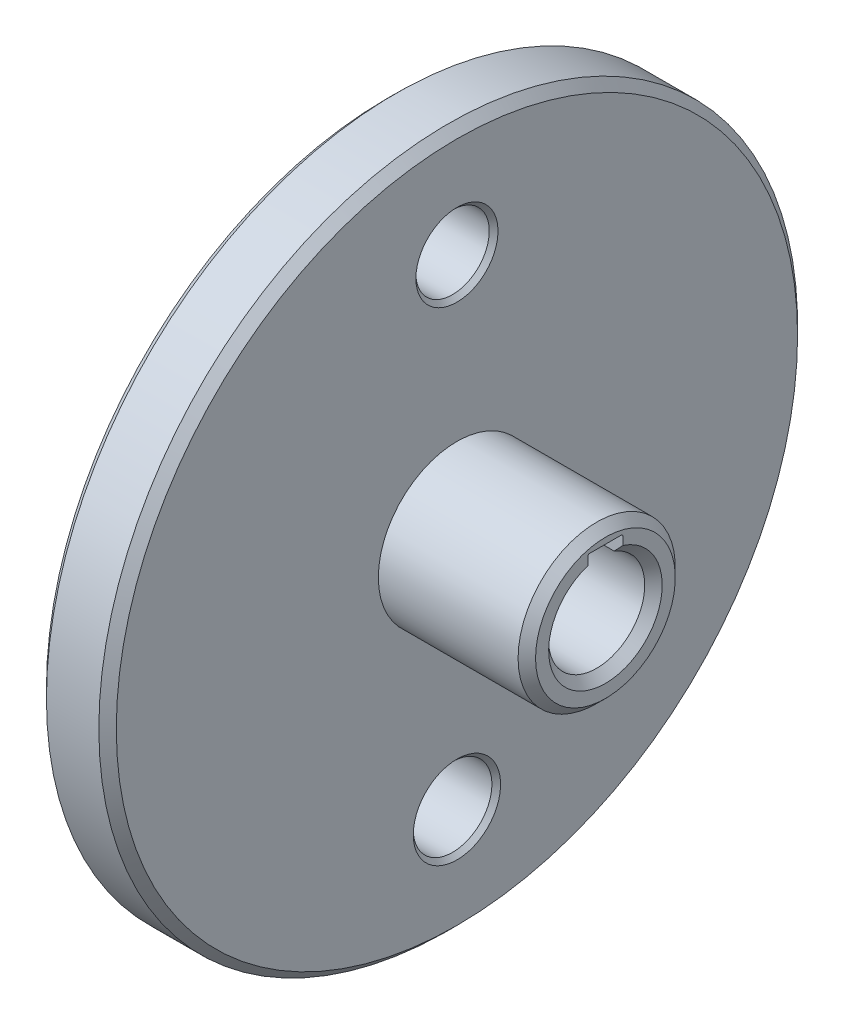
ISO-10303-21;
HEADER;
FILE_DESCRIPTION(('STEP AP214'),'2;1');
FILE_NAME('part.step','',(''),(''),'','','');
FILE_SCHEMA(('AUTOMOTIVE_DESIGN { 1 0 10303 214 1 1 1 1 }'));
ENDSEC;
DATA;
#1=APPLICATION_CONTEXT('core data for automotive mechanical design processes');
#2=APPLICATION_PROTOCOL_DEFINITION('international standard','automotive_design',2000,#1);
#3=PRODUCT_CONTEXT('',#1,'mechanical');
#4=PRODUCT('Part','Part','',(#3));
#5=PRODUCT_RELATED_PRODUCT_CATEGORY('part','',(#4));
#6=PRODUCT_DEFINITION_FORMATION('','',#4);
#7=PRODUCT_DEFINITION_CONTEXT('part definition',#1,'design');
#8=PRODUCT_DEFINITION('design','',#6,#7);
#9=PRODUCT_DEFINITION_SHAPE('','',#8);
#10=(LENGTH_UNIT() NAMED_UNIT(*) SI_UNIT(.MILLI.,.METRE.));
#11=(NAMED_UNIT(*) PLANE_ANGLE_UNIT() SI_UNIT($,.RADIAN.));
#12=(NAMED_UNIT(*) SI_UNIT($,.STERADIAN.) SOLID_ANGLE_UNIT());
#13=UNCERTAINTY_MEASURE_WITH_UNIT(LENGTH_MEASURE(1.E-05),#10,'distance_accuracy_value','');
#14=(GEOMETRIC_REPRESENTATION_CONTEXT(3) GLOBAL_UNCERTAINTY_ASSIGNED_CONTEXT((#13)) GLOBAL_UNIT_ASSIGNED_CONTEXT((#10,
#11,#12)) REPRESENTATION_CONTEXT('',''));
#15=CARTESIAN_POINT('',(0.,0.,0.));
#16=DIRECTION('',(0.,0.,1.));
#17=DIRECTION('',(1.,0.,0.));
#18=AXIS2_PLACEMENT_3D('',#15,#16,#17);
#19=CARTESIAN_POINT('',(25.,9.,0.));
#20=DIRECTION('',(-1.,0.,0.));
#21=DIRECTION('',(0.,0.,1.));
#22=AXIS2_PLACEMENT_3D('',#19,#20,#21);
#23=PLANE('',#22);
#24=CARTESIAN_POINT('',(25.,0.,0.));
#25=DIRECTION('',(-1.,0.,0.));
#26=DIRECTION('',(0.,0.,1.));
#27=AXIS2_PLACEMENT_3D('',#24,#25,#26);
#28=CIRCLE('',#27,8.00000000000001);
#29=CARTESIAN_POINT('',(25.,0.,8.00000000000001));
#30=VERTEX_POINT('',#29);
#31=EDGE_CURVE('E159',#30,#30,#28,.F.);
#32=ORIENTED_EDGE('',*,*,#31,.T.);
#33=EDGE_LOOP('',(#32));
#34=FACE_BOUND('',#33,.T.);
#35=DIRECTION('',(0.,1.,0.));
#36=VECTOR('',#35,1.);
#37=CARTESIAN_POINT('',(25.,7.30000000000003,-2.00000000000002));
#38=LINE('',#37,#36);
#39=CARTESIAN_POINT('',(25.,6.18465843842649,-2.00000000000002));
#40=VERTEX_POINT('',#39);
#41=CARTESIAN_POINT('',(25.,7.10000000000003,-2.00000000000002));
#42=VERTEX_POINT('',#41);
#43=EDGE_CURVE('E274',#40,#42,#38,.T.);
#44=ORIENTED_EDGE('',*,*,#43,.F.);
#45=CARTESIAN_POINT('',(25.,0.,0.));
#46=DIRECTION('',(-1.,0.,0.));
#47=DIRECTION('',(0.,0.,1.));
#48=AXIS2_PLACEMENT_3D('',#45,#46,#47);
#49=CIRCLE('',#48,6.50000000000001);
#50=CARTESIAN_POINT('',(25.,6.18465843842649,2.00000000000002));
#51=VERTEX_POINT('',#50);
#52=EDGE_CURVE('E162',#40,#51,#49,.T.);
#53=ORIENTED_EDGE('',*,*,#52,.T.);
#54=DIRECTION('',(0.,-1.,0.));
#55=VECTOR('',#54,1.);
#56=CARTESIAN_POINT('',(25.,7.30000000000003,2.00000000000002));
#57=LINE('',#56,#55);
#58=CARTESIAN_POINT('',(25.,7.10000000000003,2.00000000000002));
#59=VERTEX_POINT('',#58);
#60=EDGE_CURVE('E269',#59,#51,#57,.T.);
#61=ORIENTED_EDGE('',*,*,#60,.F.);
#62=CARTESIAN_POINT('',(25.,7.10000000000003,1.80000000000002));
#63=DIRECTION('',(-1.,0.,0.));
#64=DIRECTION('',(0.,0.,1.));
#65=AXIS2_PLACEMENT_3D('',#62,#63,#64);
#66=CIRCLE('',#65,0.2);
#67=CARTESIAN_POINT('',(25.,7.30000000000003,1.80000000000002));
#68=VERTEX_POINT('',#67);
#69=EDGE_CURVE('E145',#59,#68,#66,.T.);
#70=ORIENTED_EDGE('',*,*,#69,.T.);
#71=DIRECTION('',(0.,0.,1.));
#72=VECTOR('',#71,1.);
#73=CARTESIAN_POINT('',(25.,7.30000000000003,-2.00000000000002));
#74=LINE('',#73,#72);
#75=CARTESIAN_POINT('',(25.,7.30000000000003,-1.80000000000002));
#76=VERTEX_POINT('',#75);
#77=EDGE_CURVE('E271',#76,#68,#74,.T.);
#78=ORIENTED_EDGE('',*,*,#77,.F.);
#79=CARTESIAN_POINT('',(25.,7.10000000000003,-1.80000000000002));
#80=DIRECTION('',(-1.,0.,0.));
#81=DIRECTION('',(0.,0.,1.));
#82=AXIS2_PLACEMENT_3D('',#79,#80,#81);
#83=CIRCLE('',#82,0.2);
#84=EDGE_CURVE('E140',#76,#42,#83,.T.);
#85=ORIENTED_EDGE('',*,*,#84,.T.);
#86=EDGE_LOOP('',(#44,#53,#61,#70,#78,#85));
#87=FACE_BOUND('',#86,.T.);
#88=ADVANCED_FACE('F34',(#34,#87),#23,.F.);
#89=CARTESIAN_POINT('',(0.,0.,0.));
#90=DIRECTION('',(-1.,0.,0.));
#91=DIRECTION('',(0.,0.,1.));
#92=AXIS2_PLACEMENT_3D('',#89,#90,#91);
#93=CYLINDRICAL_SURFACE('',#92,5.5);
#94=DIRECTION('',(-1.,0.,0.));
#95=VECTOR('',#94,1.);
#96=CARTESIAN_POINT('',(0.,5.12347538297979,2.00000000000002));
#97=LINE('',#96,#95);
#98=CARTESIAN_POINT('',(24.,5.12347538297979,2.00000000000002));
#99=VERTEX_POINT('',#98);
#100=CARTESIAN_POINT('',(2.,5.12347538297979,2.00000000000002));
#101=VERTEX_POINT('',#100);
#102=EDGE_CURVE('E108',#99,#101,#97,.T.);
#103=ORIENTED_EDGE('',*,*,#102,.F.);
#104=CARTESIAN_POINT('',(24.,0.,0.));
#105=DIRECTION('',(-1.,0.,0.));
#106=DIRECTION('',(0.,0.,1.));
#107=AXIS2_PLACEMENT_3D('',#104,#105,#106);
#108=CIRCLE('',#107,5.5);
#109=CARTESIAN_POINT('',(24.,5.12347538297979,-2.00000000000002));
#110=VERTEX_POINT('',#109);
#111=EDGE_CURVE('E49',#99,#110,#108,.F.);
#112=ORIENTED_EDGE('',*,*,#111,.T.);
#113=DIRECTION('',(-1.,0.,0.));
#114=VECTOR('',#113,1.);
#115=CARTESIAN_POINT('',(0.,5.12347538297979,-2.00000000000002));
#116=LINE('',#115,#114);
#117=CARTESIAN_POINT('',(2.,5.12347538297979,-2.00000000000002));
#118=VERTEX_POINT('',#117);
#119=EDGE_CURVE('E96',#118,#110,#116,.F.);
#120=ORIENTED_EDGE('',*,*,#119,.F.);
#121=CARTESIAN_POINT('',(2.,0.,0.));
#122=DIRECTION('',(-1.,0.,0.));
#123=DIRECTION('',(0.,0.,1.));
#124=AXIS2_PLACEMENT_3D('',#121,#122,#123);
#125=CIRCLE('',#124,5.5);
#126=EDGE_CURVE('E106',#118,#101,#125,.T.);
#127=ORIENTED_EDGE('',*,*,#126,.T.);
#128=EDGE_LOOP('',(#103,#112,#120,#127));
#129=FACE_BOUND('',#128,.T.);
#130=ADVANCED_FACE('F105',(#129),#93,.F.);
#131=CARTESIAN_POINT('',(2.,5.5,0.));
#132=DIRECTION('',(1.,0.,0.));
#133=DIRECTION('',(0.,0.,-1.));
#134=AXIS2_PLACEMENT_3D('',#131,#132,#133);
#135=PLANE('',#134);
#136=CARTESIAN_POINT('',(2.,0.,0.));
#137=DIRECTION('',(-1.,0.,0.));
#138=DIRECTION('',(0.,0.,1.));
#139=AXIS2_PLACEMENT_3D('',#136,#137,#138);
#140=CIRCLE('',#139,12.5);
#141=CARTESIAN_POINT('',(2.,0.,12.5));
#142=VERTEX_POINT('',#141);
#143=EDGE_CURVE('E115',#142,#142,#140,.T.);
#144=ORIENTED_EDGE('',*,*,#143,.T.);
#145=EDGE_LOOP('',(#144));
#146=FACE_BOUND('',#145,.T.);
#147=DIRECTION('',(0.,-1.,0.));
#148=VECTOR('',#147,1.);
#149=CARTESIAN_POINT('',(2.,5.5,-2.00000000000002));
#150=LINE('',#149,#148);
#151=CARTESIAN_POINT('',(2.,7.10000000000003,-2.00000000000002));
#152=VERTEX_POINT('',#151);
#153=EDGE_CURVE('E94',#152,#118,#150,.T.);
#154=ORIENTED_EDGE('',*,*,#153,.F.);
#155=CARTESIAN_POINT('',(2.,7.10000000000003,-1.80000000000002));
#156=DIRECTION('',(1.,0.,0.));
#157=DIRECTION('',(0.,0.,-1.));
#158=AXIS2_PLACEMENT_3D('',#155,#156,#157);
#159=CIRCLE('',#158,0.2);
#160=CARTESIAN_POINT('',(2.,7.30000000000003,-1.80000000000002));
#161=VERTEX_POINT('',#160);
#162=EDGE_CURVE('E138',#152,#161,#159,.T.);
#163=ORIENTED_EDGE('',*,*,#162,.T.);
#164=DIRECTION('',(0.,0.,-1.));
#165=VECTOR('',#164,1.);
#166=CARTESIAN_POINT('',(2.,7.30000000000003,0.));
#167=LINE('',#166,#165);
#168=CARTESIAN_POINT('',(2.,7.30000000000003,1.80000000000002));
#169=VERTEX_POINT('',#168);
#170=EDGE_CURVE('E102',#169,#161,#167,.T.);
#171=ORIENTED_EDGE('',*,*,#170,.F.);
#172=CARTESIAN_POINT('',(2.,7.10000000000003,1.80000000000002));
#173=DIRECTION('',(1.,0.,0.));
#174=DIRECTION('',(0.,0.,-1.));
#175=AXIS2_PLACEMENT_3D('',#172,#173,#174);
#176=CIRCLE('',#175,0.2);
#177=CARTESIAN_POINT('',(2.,7.10000000000003,2.00000000000002));
#178=VERTEX_POINT('',#177);
#179=EDGE_CURVE('E143',#169,#178,#176,.T.);
#180=ORIENTED_EDGE('',*,*,#179,.T.);
#181=DIRECTION('',(0.,1.,0.));
#182=VECTOR('',#181,1.);
#183=CARTESIAN_POINT('',(2.,5.5,2.00000000000002));
#184=LINE('',#183,#182);
#185=EDGE_CURVE('E113',#101,#178,#184,.T.);
#186=ORIENTED_EDGE('',*,*,#185,.F.);
#187=ORIENTED_EDGE('',*,*,#126,.F.);
#188=EDGE_LOOP('',(#154,#163,#171,#180,#186,#187));
#189=FACE_BOUND('',#188,.T.);
#190=ADVANCED_FACE('F111',(#146,#189),#135,.F.);
#191=CARTESIAN_POINT('',(0.,0.,0.));
#192=DIRECTION('',(-1.,0.,0.));
#193=DIRECTION('',(0.,0.,1.));
#194=AXIS2_PLACEMENT_3D('',#191,#192,#193);
#195=CYLINDRICAL_SURFACE('',#194,12.5);
#196=ORIENTED_EDGE('',*,*,#143,.F.);
#197=EDGE_LOOP('',(#196));
#198=FACE_BOUND('',#197,.T.);
#199=CARTESIAN_POINT('',(0.,0.,0.));
#200=DIRECTION('',(-1.,0.,0.));
#201=DIRECTION('',(0.,0.,1.));
#202=AXIS2_PLACEMENT_3D('',#199,#200,#201);
#203=CIRCLE('',#202,12.5);
#204=CARTESIAN_POINT('',(0.,0.,12.5));
#205=VERTEX_POINT('',#204);
#206=EDGE_CURVE('E118',#205,#205,#203,.T.);
#207=ORIENTED_EDGE('',*,*,#206,.T.);
#208=EDGE_LOOP('',(#207));
#209=FACE_BOUND('',#208,.T.);
#210=ADVANCED_FACE('F210',(#198,#209),#195,.F.);
#211=CARTESIAN_POINT('',(0.,12.5,0.));
#212=DIRECTION('',(1.,0.,0.));
#213=DIRECTION('',(0.,0.,-1.));
#214=AXIS2_PLACEMENT_3D('',#211,#212,#213);
#215=PLANE('',#214);
#216=CARTESIAN_POINT('',(0.,0.,0.));
#217=DIRECTION('',(1.,0.,0.));
#218=DIRECTION('',(0.,0.,-1.));
#219=AXIS2_PLACEMENT_3D('',#216,#217,#218);
#220=CIRCLE('',#219,39.);
#221=CARTESIAN_POINT('',(0.,0.,-39.));
#222=VERTEX_POINT('',#221);
#223=EDGE_CURVE('E156',#222,#222,#220,.F.);
#224=ORIENTED_EDGE('',*,*,#223,.T.);
#225=EDGE_LOOP('',(#224));
#226=FACE_BOUND('',#225,.T.);
#227=CARTESIAN_POINT('',(0.,-27.5,-1.06119072911152E-13));
#228=DIRECTION('',(1.,0.,0.));
#229=DIRECTION('',(0.,0.,-1.));
#230=AXIS2_PLACEMENT_3D('',#227,#228,#229);
#231=CIRCLE('',#230,4.5);
#232=CARTESIAN_POINT('',(0.,-27.5,-4.50000000000011));
#233=VERTEX_POINT('',#232);
#234=EDGE_CURVE('E107',#233,#233,#231,.T.);
#235=ORIENTED_EDGE('',*,*,#234,.T.);
#236=EDGE_LOOP('',(#235));
#237=FACE_BOUND('',#236,.T.);
#238=CARTESIAN_POINT('',(0.,27.5,0.));
#239=DIRECTION('',(1.,0.,0.));
#240=DIRECTION('',(0.,0.,-1.));
#241=AXIS2_PLACEMENT_3D('',#238,#239,#240);
#242=CIRCLE('',#241,4.2);
#243=CARTESIAN_POINT('',(0.,27.5,-4.2000000000001));
#244=VERTEX_POINT('',#243);
#245=EDGE_CURVE('E121',#244,#244,#242,.T.);
#246=ORIENTED_EDGE('',*,*,#245,.T.);
#247=EDGE_LOOP('',(#246));
#248=FACE_BOUND('',#247,.T.);
#249=ORIENTED_EDGE('',*,*,#206,.F.);
#250=EDGE_LOOP('',(#249));
#251=FACE_BOUND('',#250,.T.);
#252=ADVANCED_FACE('F227',(#226,#237,#248,#251),#215,.F.);
#253=CARTESIAN_POINT('',(0.,0.,0.));
#254=DIRECTION('',(-1.,0.,0.));
#255=DIRECTION('',(0.,0.,1.));
#256=AXIS2_PLACEMENT_3D('',#253,#254,#255);
#257=CYLINDRICAL_SURFACE('',#256,40.);
#258=CARTESIAN_POINT('',(7.,0.,0.));
#259=DIRECTION('',(-1.,0.,0.));
#260=DIRECTION('',(0.,0.,1.));
#261=AXIS2_PLACEMENT_3D('',#258,#259,#260);
#262=CIRCLE('',#261,40.);
#263=CARTESIAN_POINT('',(7.,0.,40.));
#264=VERTEX_POINT('',#263);
#265=EDGE_CURVE('E150',#264,#264,#262,.T.);
#266=ORIENTED_EDGE('',*,*,#265,.T.);
#267=EDGE_LOOP('',(#266));
#268=FACE_BOUND('',#267,.T.);
#269=CARTESIAN_POINT('',(1.00000000000002,0.,0.));
#270=DIRECTION('',(1.,0.,0.));
#271=DIRECTION('',(0.,0.,-1.));
#272=AXIS2_PLACEMENT_3D('',#269,#270,#271);
#273=CIRCLE('',#272,40.);
#274=CARTESIAN_POINT('',(1.00000000000002,0.,-40.));
#275=VERTEX_POINT('',#274);
#276=EDGE_CURVE('E147',#275,#275,#273,.T.);
#277=ORIENTED_EDGE('',*,*,#276,.T.);
#278=EDGE_LOOP('',(#277));
#279=FACE_BOUND('',#278,.T.);
#280=ADVANCED_FACE('F223',(#268,#279),#257,.T.);
#281=CARTESIAN_POINT('',(8.,40.,0.));
#282=DIRECTION('',(-1.,0.,0.));
#283=DIRECTION('',(0.,0.,1.));
#284=AXIS2_PLACEMENT_3D('',#281,#282,#283);
#285=PLANE('',#284);
#286=CARTESIAN_POINT('',(8.,-27.5,-1.06119072911152E-13));
#287=DIRECTION('',(-1.,0.,0.));
#288=DIRECTION('',(0.,0.,1.));
#289=AXIS2_PLACEMENT_3D('',#286,#287,#288);
#290=CIRCLE('',#289,5.00000000000001);
#291=CARTESIAN_POINT('',(8.,-27.5,4.9999999999999));
#292=VERTEX_POINT('',#291);
#293=EDGE_CURVE('E42',#292,#292,#290,.T.);
#294=ORIENTED_EDGE('',*,*,#293,.T.);
#295=EDGE_LOOP('',(#294));
#296=FACE_BOUND('',#295,.T.);
#297=CARTESIAN_POINT('',(8.,27.5,0.));
#298=DIRECTION('',(-1.,0.,0.));
#299=DIRECTION('',(0.,0.,1.));
#300=AXIS2_PLACEMENT_3D('',#297,#298,#299);
#301=CIRCLE('',#300,4.7);
#302=CARTESIAN_POINT('',(8.,27.5,4.6999999999999));
#303=VERTEX_POINT('',#302);
#304=EDGE_CURVE('E405',#303,#303,#301,.T.);
#305=ORIENTED_EDGE('',*,*,#304,.T.);
#306=EDGE_LOOP('',(#305));
#307=FACE_BOUND('',#306,.T.);
#308=CARTESIAN_POINT('',(8.,0.,0.));
#309=DIRECTION('',(-1.,0.,0.));
#310=DIRECTION('',(0.,0.,1.));
#311=AXIS2_PLACEMENT_3D('',#308,#309,#310);
#312=CIRCLE('',#311,39.);
#313=CARTESIAN_POINT('',(8.,0.,39.));
#314=VERTEX_POINT('',#313);
#315=EDGE_CURVE('E153',#314,#314,#312,.F.);
#316=ORIENTED_EDGE('',*,*,#315,.T.);
#317=EDGE_LOOP('',(#316));
#318=FACE_BOUND('',#317,.T.);
#319=CARTESIAN_POINT('',(8.,0.,0.));
#320=DIRECTION('',(-1.,0.,0.));
#321=DIRECTION('',(0.,0.,1.));
#322=AXIS2_PLACEMENT_3D('',#319,#320,#321);
#323=CIRCLE('',#322,9.);
#324=CARTESIAN_POINT('',(8.,0.,9.));
#325=VERTEX_POINT('',#324);
#326=EDGE_CURVE('E114',#325,#325,#323,.T.);
#327=ORIENTED_EDGE('',*,*,#326,.T.);
#328=EDGE_LOOP('',(#327));
#329=FACE_BOUND('',#328,.T.);
#330=ADVANCED_FACE('F219',(#296,#307,#318,#329),#285,.F.);
#331=CARTESIAN_POINT('',(0.,0.,0.));
#332=DIRECTION('',(-1.,0.,0.));
#333=DIRECTION('',(0.,0.,1.));
#334=AXIS2_PLACEMENT_3D('',#331,#332,#333);
#335=CYLINDRICAL_SURFACE('',#334,9.);
#336=CARTESIAN_POINT('',(24.,0.,0.));
#337=DIRECTION('',(-1.,0.,0.));
#338=DIRECTION('',(0.,0.,1.));
#339=AXIS2_PLACEMENT_3D('',#336,#337,#338);
#340=CIRCLE('',#339,9.);
#341=CARTESIAN_POINT('',(24.,0.,9.));
#342=VERTEX_POINT('',#341);
#343=EDGE_CURVE('E193',#342,#342,#340,.T.);
#344=ORIENTED_EDGE('',*,*,#343,.T.);
#345=EDGE_LOOP('',(#344));
#346=FACE_BOUND('',#345,.T.);
#347=ORIENTED_EDGE('',*,*,#326,.F.);
#348=EDGE_LOOP('',(#347));
#349=FACE_BOUND('',#348,.T.);
#350=ADVANCED_FACE('F206',(#346,#349),#335,.T.);
#351=CARTESIAN_POINT('',(25.,27.5,0.));
#352=DIRECTION('',(-1.,0.,0.));
#353=DIRECTION('',(0.,0.,1.));
#354=AXIS2_PLACEMENT_3D('',#351,#352,#353);
#355=CYLINDRICAL_SURFACE('',#354,4.2);
#356=CARTESIAN_POINT('',(7.49999999999999,27.5,0.));
#357=DIRECTION('',(-1.,0.,0.));
#358=DIRECTION('',(0.,0.,1.));
#359=AXIS2_PLACEMENT_3D('',#356,#357,#358);
#360=CIRCLE('',#359,4.2);
#361=CARTESIAN_POINT('',(7.49999999999999,27.5,4.19999999999991));
#362=VERTEX_POINT('',#361);
#363=EDGE_CURVE('E11',#362,#362,#360,.F.);
#364=ORIENTED_EDGE('',*,*,#363,.T.);
#365=EDGE_LOOP('',(#364));
#366=FACE_BOUND('',#365,.T.);
#367=ORIENTED_EDGE('',*,*,#245,.F.);
#368=EDGE_LOOP('',(#367));
#369=FACE_BOUND('',#368,.T.);
#370=ADVANCED_FACE('F202',(#366,#369),#355,.F.);
#371=CARTESIAN_POINT('',(25.,-27.5,-1.06119072911152E-13));
#372=DIRECTION('',(-1.,0.,0.));
#373=DIRECTION('',(0.,0.,1.));
#374=AXIS2_PLACEMENT_3D('',#371,#372,#373);
#375=CYLINDRICAL_SURFACE('',#374,4.5);
#376=CARTESIAN_POINT('',(7.5,-27.5,-1.06119072911152E-13));
#377=DIRECTION('',(-1.,0.,0.));
#378=DIRECTION('',(0.,0.,1.));
#379=AXIS2_PLACEMENT_3D('',#376,#377,#378);
#380=CIRCLE('',#379,4.5);
#381=CARTESIAN_POINT('',(7.5,-27.5,4.49999999999989));
#382=VERTEX_POINT('',#381);
#383=EDGE_CURVE('E408',#382,#382,#380,.F.);
#384=ORIENTED_EDGE('',*,*,#383,.T.);
#385=EDGE_LOOP('',(#384));
#386=FACE_BOUND('',#385,.T.);
#387=ORIENTED_EDGE('',*,*,#234,.F.);
#388=EDGE_LOOP('',(#387));
#389=FACE_BOUND('',#388,.T.);
#390=ADVANCED_FACE('F199',(#386,#389),#375,.F.);
#391=CARTESIAN_POINT('',(25.,7.30000000000003,-2.00000000000002));
#392=DIRECTION('',(0.,0.,1.));
#393=DIRECTION('',(1.,0.,0.));
#394=AXIS2_PLACEMENT_3D('',#391,#392,#393);
#395=PLANE('',#394);
#396=ORIENTED_EDGE('',*,*,#119,.T.);
#397=CARTESIAN_POINT('',(24.,5.12347538297979,-2.00000000000002));
#398=CARTESIAN_POINT('',(24.0828251706964,5.21238503394926,-2.00000000000002));
#399=CARTESIAN_POINT('',(24.1658004879446,5.30115459754863,-2.00000000000002));
#400=CARTESIAN_POINT('',(24.33201525737,5.4784449735909,-2.00000000000002));
#401=CARTESIAN_POINT('',(24.4152547077199,5.56696578774673,-2.00000000000002));
#402=CARTESIAN_POINT('',(24.5819625961778,5.74379117352451,-2.00000000000002));
#403=CARTESIAN_POINT('',(24.6654310339187,5.83209574549255,-2.00000000000002));
#404=CARTESIAN_POINT('',(24.8325704963148,6.00851413113025,-2.00000000000002));
#405=CARTESIAN_POINT('',(24.9162415223627,6.09662794348051,-2.00000000000002));
#406=CARTESIAN_POINT('',(25.,6.18465843842649,-2.00000000000002));
#407=B_SPLINE_CURVE_WITH_KNOTS('',3,(#397,#398,#399,#400,#401,#402,#403,#404,#405,#406),
.UNSPECIFIED.,.F.,.F.,(4,2,2,2,4),(0.,0.36453274511342,0.729062973788622,1.09359261865378,
1.45812477680436),.UNSPECIFIED.);
#408=EDGE_CURVE('E186',#110,#40,#407,.T.);
#409=ORIENTED_EDGE('',*,*,#408,.T.);
#410=ORIENTED_EDGE('',*,*,#43,.T.);
#411=DIRECTION('',(-1.,0.,0.));
#412=VECTOR('',#411,1.);
#413=CARTESIAN_POINT('',(2.,7.10000000000003,-2.00000000000002));
#414=LINE('',#413,#412);
#415=EDGE_CURVE('E99',#42,#152,#414,.T.);
#416=ORIENTED_EDGE('',*,*,#415,.T.);
#417=ORIENTED_EDGE('',*,*,#153,.T.);
#418=EDGE_LOOP('',(#396,#409,#410,#416,#417));
#419=FACE_BOUND('',#418,.T.);
#420=ADVANCED_FACE('F95',(#419),#395,.T.);
#421=CARTESIAN_POINT('',(25.,7.30000000000003,-2.00000000000002));
#422=DIRECTION('',(0.,-1.,0.));
#423=DIRECTION('',(0.,0.,-1.));
#424=AXIS2_PLACEMENT_3D('',#421,#422,#423);
#425=PLANE('',#424);
#426=ORIENTED_EDGE('',*,*,#170,.T.);
#427=DIRECTION('',(-1.,0.,0.));
#428=VECTOR('',#427,1.);
#429=CARTESIAN_POINT('',(25.,7.30000000000003,-1.80000000000002));
#430=LINE('',#429,#428);
#431=EDGE_CURVE('E134',#161,#76,#430,.F.);
#432=ORIENTED_EDGE('',*,*,#431,.T.);
#433=ORIENTED_EDGE('',*,*,#77,.T.);
#434=DIRECTION('',(-1.,0.,0.));
#435=VECTOR('',#434,1.);
#436=CARTESIAN_POINT('',(2.,7.30000000000003,1.80000000000002));
#437=LINE('',#436,#435);
#438=EDGE_CURVE('E131',#68,#169,#437,.T.);
#439=ORIENTED_EDGE('',*,*,#438,.T.);
#440=EDGE_LOOP('',(#426,#432,#433,#439));
#441=FACE_BOUND('',#440,.T.);
#442=ADVANCED_FACE('F198',(#441),#425,.T.);
#443=CARTESIAN_POINT('',(25.,7.30000000000003,2.00000000000002));
#444=DIRECTION('',(0.,0.,-1.));
#445=DIRECTION('',(-1.,0.,0.));
#446=AXIS2_PLACEMENT_3D('',#443,#444,#445);
#447=PLANE('',#446);
#448=ORIENTED_EDGE('',*,*,#60,.T.);
#449=CARTESIAN_POINT('',(25.,6.18465843842649,2.00000000000002));
#450=CARTESIAN_POINT('',(24.9162415223627,6.09662794348051,2.00000000000002));
#451=CARTESIAN_POINT('',(24.8325704963148,6.00851413113025,2.00000000000002));
#452=CARTESIAN_POINT('',(24.6654310339187,5.83209574549254,2.00000000000002));
#453=CARTESIAN_POINT('',(24.5819625961778,5.74379117352451,2.00000000000002));
#454=CARTESIAN_POINT('',(24.4152547077199,5.56696578774673,2.00000000000002));
#455=CARTESIAN_POINT('',(24.33201525737,5.4784449735909,2.00000000000002));
#456=CARTESIAN_POINT('',(24.1658004879446,5.30115459754864,2.00000000000002));
#457=CARTESIAN_POINT('',(24.0828251706964,5.21238503394926,2.00000000000002));
#458=CARTESIAN_POINT('',(24.,5.12347538297979,2.00000000000002));
#459=B_SPLINE_CURVE_WITH_KNOTS('',3,(#449,#450,#451,#452,#453,#454,#455,#456,#457,#458),
.UNSPECIFIED.,.F.,.F.,(4,2,2,2,4),(0.,0.364532158150581,0.729061803015738,1.09359203169094,
1.45812477680436),.UNSPECIFIED.);
#460=EDGE_CURVE('E57',#51,#99,#459,.T.);
#461=ORIENTED_EDGE('',*,*,#460,.T.);
#462=ORIENTED_EDGE('',*,*,#102,.T.);
#463=ORIENTED_EDGE('',*,*,#185,.T.);
#464=DIRECTION('',(-1.,0.,0.));
#465=VECTOR('',#464,1.);
#466=CARTESIAN_POINT('',(25.,7.10000000000003,2.00000000000002));
#467=LINE('',#466,#465);
#468=EDGE_CURVE('E136',#178,#59,#467,.F.);
#469=ORIENTED_EDGE('',*,*,#468,.T.);
#470=EDGE_LOOP('',(#448,#461,#462,#463,#469));
#471=FACE_BOUND('',#470,.T.);
#472=ADVANCED_FACE('F173',(#471),#447,.T.);
#473=CARTESIAN_POINT('',(25.,7.10000000000003,-1.80000000000002));
#474=DIRECTION('',(1.,0.,0.));
#475=DIRECTION('',(0.,0.,-1.));
#476=AXIS2_PLACEMENT_3D('',#473,#474,#475);
#477=CYLINDRICAL_SURFACE('',#476,0.2);
#478=ORIENTED_EDGE('',*,*,#84,.F.);
#479=ORIENTED_EDGE('',*,*,#431,.F.);
#480=ORIENTED_EDGE('',*,*,#162,.F.);
#481=ORIENTED_EDGE('',*,*,#415,.F.);
#482=EDGE_LOOP('',(#478,#479,#480,#481));
#483=FACE_BOUND('',#482,.T.);
#484=ADVANCED_FACE('F235',(#483),#477,.F.);
#485=CARTESIAN_POINT('',(25.,7.10000000000003,1.80000000000002));
#486=DIRECTION('',(1.,0.,0.));
#487=DIRECTION('',(0.,0.,-1.));
#488=AXIS2_PLACEMENT_3D('',#485,#486,#487);
#489=CYLINDRICAL_SURFACE('',#488,0.2);
#490=ORIENTED_EDGE('',*,*,#69,.F.);
#491=ORIENTED_EDGE('',*,*,#468,.F.);
#492=ORIENTED_EDGE('',*,*,#179,.F.);
#493=ORIENTED_EDGE('',*,*,#438,.F.);
#494=EDGE_LOOP('',(#490,#491,#492,#493));
#495=FACE_BOUND('',#494,.T.);
#496=ADVANCED_FACE('F238',(#495),#489,.F.);
#497=CARTESIAN_POINT('',(7.,0.,0.));
#498=DIRECTION('',(-1.,0.,0.));
#499=DIRECTION('',(0.,0.,1.));
#500=AXIS2_PLACEMENT_3D('',#497,#498,#499);
#501=CONICAL_SURFACE('',#500,40.,0.785398163397448);
#502=ORIENTED_EDGE('',*,*,#315,.F.);
#503=EDGE_LOOP('',(#502));
#504=FACE_BOUND('',#503,.T.);
#505=ORIENTED_EDGE('',*,*,#265,.F.);
#506=EDGE_LOOP('',(#505));
#507=FACE_BOUND('',#506,.T.);
#508=ADVANCED_FACE('F241',(#504,#507),#501,.T.);
#509=CARTESIAN_POINT('',(0.,0.,0.));
#510=DIRECTION('',(1.,0.,0.));
#511=DIRECTION('',(0.,0.,-1.));
#512=AXIS2_PLACEMENT_3D('',#509,#510,#511);
#513=CONICAL_SURFACE('',#512,39.,0.785398163397441);
#514=ORIENTED_EDGE('',*,*,#276,.F.);
#515=EDGE_LOOP('',(#514));
#516=FACE_BOUND('',#515,.T.);
#517=ORIENTED_EDGE('',*,*,#223,.F.);
#518=EDGE_LOOP('',(#517));
#519=FACE_BOUND('',#518,.T.);
#520=ADVANCED_FACE('F182',(#516,#519),#513,.T.);
#521=CARTESIAN_POINT('',(25.,0.,0.));
#522=DIRECTION('',(1.,0.,0.));
#523=DIRECTION('',(0.,0.,-1.));
#524=AXIS2_PLACEMENT_3D('',#521,#522,#523);
#525=CONICAL_SURFACE('',#524,6.50000000000001,0.785398163397444);
#526=ORIENTED_EDGE('',*,*,#408,.F.);
#527=ORIENTED_EDGE('',*,*,#111,.F.);
#528=ORIENTED_EDGE('',*,*,#460,.F.);
#529=ORIENTED_EDGE('',*,*,#52,.F.);
#530=EDGE_LOOP('',(#526,#527,#528,#529));
#531=FACE_BOUND('',#530,.T.);
#532=ADVANCED_FACE('F176',(#531),#525,.F.);
#533=CARTESIAN_POINT('',(24.,0.,0.));
#534=DIRECTION('',(-1.,0.,0.));
#535=DIRECTION('',(0.,0.,1.));
#536=AXIS2_PLACEMENT_3D('',#533,#534,#535);
#537=CONICAL_SURFACE('',#536,9.,0.785398163397458);
#538=ORIENTED_EDGE('',*,*,#31,.F.);
#539=EDGE_LOOP('',(#538));
#540=FACE_BOUND('',#539,.T.);
#541=ORIENTED_EDGE('',*,*,#343,.F.);
#542=EDGE_LOOP('',(#541));
#543=FACE_BOUND('',#542,.T.);
#544=ADVANCED_FACE('F181',(#540,#543),#537,.T.);
#545=CARTESIAN_POINT('',(7.5,-27.5,-1.06119072911152E-13));
#546=DIRECTION('',(1.,0.,0.));
#547=DIRECTION('',(0.,0.,-1.));
#548=AXIS2_PLACEMENT_3D('',#545,#546,#547);
#549=CONICAL_SURFACE('',#548,4.5,0.785398163397448);
#550=ORIENTED_EDGE('',*,*,#293,.F.);
#551=EDGE_LOOP('',(#550));
#552=FACE_BOUND('',#551,.T.);
#553=ORIENTED_EDGE('',*,*,#383,.F.);
#554=EDGE_LOOP('',(#553));
#555=FACE_BOUND('',#554,.T.);
#556=ADVANCED_FACE('F382',(#552,#555),#549,.F.);
#557=CARTESIAN_POINT('',(7.49999999999999,27.5,0.));
#558=DIRECTION('',(1.,0.,0.));
#559=DIRECTION('',(0.,0.,-1.));
#560=AXIS2_PLACEMENT_3D('',#557,#558,#559);
#561=CONICAL_SURFACE('',#560,4.2,0.785398163397435);
#562=ORIENTED_EDGE('',*,*,#304,.F.);
#563=EDGE_LOOP('',(#562));
#564=FACE_BOUND('',#563,.T.);
#565=ORIENTED_EDGE('',*,*,#363,.F.);
#566=EDGE_LOOP('',(#565));
#567=FACE_BOUND('',#566,.T.);
#568=ADVANCED_FACE('F36',(#564,#567),#561,.F.);
#569=CLOSED_SHELL('',(#88,#130,#190,#210,#252,#280,#330,#350,#370,#390,#420,#442,#472,#484,#496,
#508,#520,#532,#544,#556,#568));
#570=MANIFOLD_SOLID_BREP('B2',#569);
#571=ADVANCED_BREP_SHAPE_REPRESENTATION('',(#18,#570),#14);
#572=SHAPE_DEFINITION_REPRESENTATION(#9,#571);
ENDSEC;
END-ISO-10303-21;
